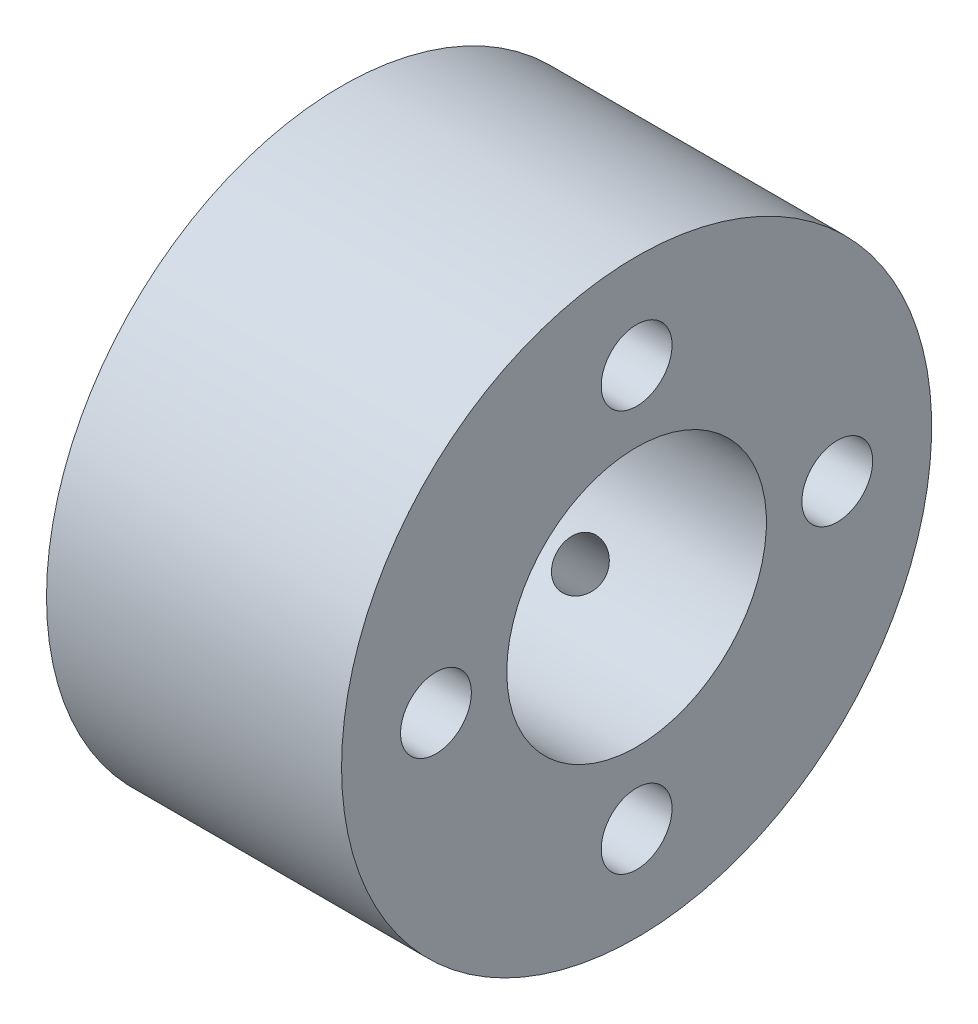
ISO-10303-21;
HEADER;
FILE_DESCRIPTION(('STEP AP214'),'2;1');
FILE_NAME('part.step','',(''),(''),'','','');
FILE_SCHEMA(('AUTOMOTIVE_DESIGN { 1 0 10303 214 1 1 1 1 }'));
ENDSEC;
DATA;
#1=APPLICATION_CONTEXT('core data for automotive mechanical design processes');
#2=APPLICATION_PROTOCOL_DEFINITION('international standard','automotive_design',2000,#1);
#3=PRODUCT_CONTEXT('',#1,'mechanical');
#4=PRODUCT('Part','Part','',(#3));
#5=PRODUCT_RELATED_PRODUCT_CATEGORY('part','',(#4));
#6=PRODUCT_DEFINITION_FORMATION('','',#4);
#7=PRODUCT_DEFINITION_CONTEXT('part definition',#1,'design');
#8=PRODUCT_DEFINITION('design','',#6,#7);
#9=PRODUCT_DEFINITION_SHAPE('','',#8);
#10=(LENGTH_UNIT() NAMED_UNIT(*) SI_UNIT(.MILLI.,.METRE.));
#11=(NAMED_UNIT(*) PLANE_ANGLE_UNIT() SI_UNIT($,.RADIAN.));
#12=(NAMED_UNIT(*) SI_UNIT($,.STERADIAN.) SOLID_ANGLE_UNIT());
#13=UNCERTAINTY_MEASURE_WITH_UNIT(LENGTH_MEASURE(1.E-05),#10,'distance_accuracy_value','');
#14=(GEOMETRIC_REPRESENTATION_CONTEXT(3) GLOBAL_UNCERTAINTY_ASSIGNED_CONTEXT((#13)) GLOBAL_UNIT_ASSIGNED_CONTEXT((#10,
#11,#12)) REPRESENTATION_CONTEXT('',''));
#15=CARTESIAN_POINT('',(0.,0.,0.));
#16=DIRECTION('',(0.,0.,1.));
#17=DIRECTION('',(1.,0.,0.));
#18=AXIS2_PLACEMENT_3D('',#15,#16,#17);
#19=CARTESIAN_POINT('',(-12.5,0.,-25.));
#20=DIRECTION('',(1.,0.,0.));
#21=DIRECTION('',(0.,0.,-1.));
#22=AXIS2_PLACEMENT_3D('',#19,#20,#21);
#23=PLANE('',#22);
#24=CARTESIAN_POINT('',(-12.5,1.78065548281E-13,17.));
#25=DIRECTION('',(1.,0.,0.));
#26=DIRECTION('',(0.,0.,-1.));
#27=AXIS2_PLACEMENT_3D('',#24,#25,#26);
#28=CIRCLE('',#27,3.);
#29=CARTESIAN_POINT('',(-12.5,1.78065548281E-13,14.));
#30=VERTEX_POINT('',#29);
#31=EDGE_CURVE('E69',#30,#30,#28,.T.);
#32=ORIENTED_EDGE('',*,*,#31,.T.);
#33=EDGE_LOOP('',(#32));
#34=FACE_BOUND('',#33,.T.);
#35=CARTESIAN_POINT('',(-12.5,-17.,0.));
#36=DIRECTION('',(1.,0.,0.));
#37=DIRECTION('',(0.,0.,-1.));
#38=AXIS2_PLACEMENT_3D('',#35,#36,#37);
#39=CIRCLE('',#38,3.);
#40=CARTESIAN_POINT('',(-12.5,-17.,-3.));
#41=VERTEX_POINT('',#40);
#42=EDGE_CURVE('E63',#41,#41,#39,.T.);
#43=ORIENTED_EDGE('',*,*,#42,.T.);
#44=EDGE_LOOP('',(#43));
#45=FACE_BOUND('',#44,.T.);
#46=CARTESIAN_POINT('',(-12.5,0.,-17.));
#47=DIRECTION('',(1.,0.,0.));
#48=DIRECTION('',(0.,0.,-1.));
#49=AXIS2_PLACEMENT_3D('',#46,#47,#48);
#50=CIRCLE('',#49,3.);
#51=CARTESIAN_POINT('',(-12.5,0.,-20.));
#52=VERTEX_POINT('',#51);
#53=EDGE_CURVE('E57',#52,#52,#50,.T.);
#54=ORIENTED_EDGE('',*,*,#53,.T.);
#55=EDGE_LOOP('',(#54));
#56=FACE_BOUND('',#55,.T.);
#57=CARTESIAN_POINT('',(-12.5,17.,0.));
#58=DIRECTION('',(1.,0.,0.));
#59=DIRECTION('',(0.,0.,-1.));
#60=AXIS2_PLACEMENT_3D('',#57,#58,#59);
#61=CIRCLE('',#60,3.);
#62=CARTESIAN_POINT('',(-12.5,17.,-3.));
#63=VERTEX_POINT('',#62);
#64=EDGE_CURVE('E51',#63,#63,#61,.T.);
#65=ORIENTED_EDGE('',*,*,#64,.T.);
#66=EDGE_LOOP('',(#65));
#67=FACE_BOUND('',#66,.T.);
#68=CARTESIAN_POINT('',(-12.5,0.,0.));
#69=DIRECTION('',(-1.,0.,0.));
#70=DIRECTION('',(0.,0.,1.));
#71=AXIS2_PLACEMENT_3D('',#68,#69,#70);
#72=CIRCLE('',#71,11.);
#73=CARTESIAN_POINT('',(-12.5,0.,11.));
#74=VERTEX_POINT('',#73);
#75=EDGE_CURVE('E10',#74,#74,#72,.T.);
#76=ORIENTED_EDGE('',*,*,#75,.F.);
#77=EDGE_LOOP('',(#76));
#78=FACE_BOUND('',#77,.T.);
#79=CARTESIAN_POINT('',(-12.5,0.,0.));
#80=DIRECTION('',(-1.,0.,0.));
#81=DIRECTION('',(0.,0.,1.));
#82=AXIS2_PLACEMENT_3D('',#79,#80,#81);
#83=CIRCLE('',#82,25.);
#84=CARTESIAN_POINT('',(-12.5,0.,25.));
#85=VERTEX_POINT('',#84);
#86=EDGE_CURVE('E46',#85,#85,#83,.T.);
#87=ORIENTED_EDGE('',*,*,#86,.T.);
#88=EDGE_LOOP('',(#87));
#89=FACE_BOUND('',#88,.T.);
#90=ADVANCED_FACE('F32',(#34,#45,#56,#67,#78,#89),#23,.F.);
#91=CARTESIAN_POINT('',(-25.731009954246,0.,0.));
#92=DIRECTION('',(-1.,0.,0.));
#93=DIRECTION('',(0.,0.,1.));
#94=AXIS2_PLACEMENT_3D('',#91,#92,#93);
#95=CYLINDRICAL_SURFACE('',#94,11.);
#96=CARTESIAN_POINT('',(0.,-6.23426021657251,-9.06278100541226));
#97=CARTESIAN_POINT('',(0.11134012257296,-6.23426477961424,-9.06277944137561));
#98=CARTESIAN_POINT('',(0.222737191288004,-6.24208562750692,-9.05741323905407));
#99=CARTESIAN_POINT('',(0.442394615872968,-6.27304058059289,-9.03600036843822));
#100=CARTESIAN_POINT('',(0.550652159669281,-6.29618799696593,-9.01994441599062));
#101=CARTESIAN_POINT('',(0.760820313018509,-6.35676231108609,-8.97735672941962));
#102=CARTESIAN_POINT('',(0.86273656530805,-6.39417629621741,-8.95083446755676));
#103=CARTESIAN_POINT('',(1.05752989162896,-6.48173149232353,-8.88763515920769));
#104=CARTESIAN_POINT('',(1.15040775801637,-6.53187158626262,-8.85095900395503));
#105=CARTESIAN_POINT('',(1.32558344744175,-6.64351822106949,-8.7674717908282));
#106=CARTESIAN_POINT('',(1.40776007423395,-6.70513847138314,-8.72055846017584));
#107=CARTESIAN_POINT('',(1.55814556283442,-6.83709248151678,-8.61749162693693));
#108=CARTESIAN_POINT('',(1.62635353364537,-6.90742679670856,-8.56133753533584));
#109=CARTESIAN_POINT('',(1.74732731845023,-7.05483669509965,-8.4402858707826));
#110=CARTESIAN_POINT('',(1.7999792699958,-7.13195687014483,-8.37532867005698));
#111=CARTESIAN_POINT('',(1.88761333302614,-7.28982236911334,-8.23828874395049));
#112=CARTESIAN_POINT('',(1.92259681050937,-7.37056741226238,-8.16620656993634));
#113=CARTESIAN_POINT('',(1.97352723325545,-7.53209778677381,-8.01744479612685));
#114=CARTESIAN_POINT('',(1.98967831432072,-7.61287300728532,-7.94082414054494));
#115=CARTESIAN_POINT('',(2.0031211674624,-7.77281962365421,-7.78432966687779));
#116=CARTESIAN_POINT('',(2.00041445357154,-7.85199114775545,-7.70445611046955));
#117=CARTESIAN_POINT('',(1.97637585792208,-8.00554269249041,-7.5447609862395));
#118=CARTESIAN_POINT('',(1.95526374648556,-8.07996816900079,-7.46494988896201));
#119=CARTESIAN_POINT('',(1.89536080253849,-8.22316515477451,-7.3069099746159));
#120=CARTESIAN_POINT('',(1.85656935461376,-8.29193646711916,-7.22868121272708));
#121=CARTESIAN_POINT('',(1.76219694022084,-8.42267707941132,-7.07592274519043));
#122=CARTESIAN_POINT('',(1.70652735596616,-8.4846080642971,-7.00141504205228));
#123=CARTESIAN_POINT('',(1.58004411007531,-8.60009939889827,-6.85906009060543));
#124=CARTESIAN_POINT('',(1.5092289970645,-8.65365894553856,-6.79121348152976));
#125=CARTESIAN_POINT('',(1.35325154542072,-8.75227487471011,-6.66365439383408));
#126=CARTESIAN_POINT('',(1.26789698208101,-8.79719745339056,-6.60407336861961));
#127=CARTESIAN_POINT('',(1.08590593607908,-8.87693798147825,-6.49649671967161));
#128=CARTESIAN_POINT('',(0.989269307234741,-8.91175579993738,-6.4485012460772));
#129=CARTESIAN_POINT('',(0.787217489513175,-8.97089048622427,-6.36598125808041));
#130=CARTESIAN_POINT('',(0.681789168360213,-8.99519129699531,-6.3314773498981));
#131=CARTESIAN_POINT('',(0.465282550111633,-9.03291206143895,-6.27754677266933));
#132=CARTESIAN_POINT('',(0.354204853488858,-9.04633316895866,-6.25811850478495));
#133=CARTESIAN_POINT('',(0.131240198794593,-9.06202045215445,-6.23538096899007));
#134=CARTESIAN_POINT('',(0.0193870673303661,-9.06444215137262,-6.23184697480502));
#135=CARTESIAN_POINT('',(-0.203424550561073,-9.05852539024086,-6.2404442149272));
#136=CARTESIAN_POINT('',(-0.31438307821396,-9.05018742860907,-6.25257472317333));
#137=CARTESIAN_POINT('',(-0.53138034405228,-9.02295894171529,-6.29180172386521));
#138=CARTESIAN_POINT('',(-0.637450384008025,-9.00415015930598,-6.31878226787442));
#139=CARTESIAN_POINT('',(-0.842659718828439,-8.956259449642,-6.38647989757827));
#140=CARTESIAN_POINT('',(-0.941798529085674,-8.92717680493338,-6.42719794259396));
#141=CARTESIAN_POINT('',(-1.13151919601524,-8.85871205584504,-6.52124434033618));
#142=CARTESIAN_POINT('',(-1.22199611808438,-8.81922124626785,-6.57470518205023));
#143=CARTESIAN_POINT('',(-1.39073369159775,-8.73060200666712,-6.69193357063052));
#144=CARTESIAN_POINT('',(-1.46899331199965,-8.68147276402579,-6.75570198645008));
#145=CARTESIAN_POINT('',(-1.61207284614978,-8.57361773576237,-6.89207631790516));
#146=CARTESIAN_POINT('',(-1.6767123553618,-8.51477957189947,-6.96478282320701));
#147=CARTESIAN_POINT('',(-1.78944630608299,-8.38898885712261,-7.11579290730796));
#148=CARTESIAN_POINT('',(-1.83754135727717,-8.32203660534642,-7.1940962797267));
#149=CARTESIAN_POINT('',(-1.91554803863643,-8.18177436519711,-7.3532135689415));
#150=CARTESIAN_POINT('',(-1.94554990487653,-8.10849804634402,-7.43401287835824));
#151=CARTESIAN_POINT('',(-1.98680734329715,-7.95709442263709,-7.59584868532176));
#152=CARTESIAN_POINT('',(-1.9980647651367,-7.87896759720945,-7.67688515867509));
#153=CARTESIAN_POINT('',(-2.00145252110551,-7.72117943420264,-7.83554260534047));
#154=CARTESIAN_POINT('',(-1.99385588848468,-7.64155638140332,-7.91319595453523));
#155=CARTESIAN_POINT('',(-1.96034705357606,-7.48206158678988,-8.0641686451913));
#156=CARTESIAN_POINT('',(-1.93443500480099,-7.40218984706575,-8.1374880229727));
#157=CARTESIAN_POINT('',(-1.86514309651073,-7.24483361499591,-8.27789207306368));
#158=CARTESIAN_POINT('',(-1.82179065462444,-7.16734558015666,-8.34498632894287));
#159=CARTESIAN_POINT('',(-1.71888059719124,-7.01715010930546,-8.47167451800135));
#160=CARTESIAN_POINT('',(-1.65932198372258,-6.94444296802736,-8.53126798897683));
#161=CARTESIAN_POINT('',(-1.52474236143811,-6.80533458442532,-8.64265465566911));
#162=CARTESIAN_POINT('',(-1.44952330461566,-6.7390318182601,-8.6943315779268));
#163=CARTESIAN_POINT('',(-1.28617048330646,-6.61625629247002,-8.78812475655437));
#164=CARTESIAN_POINT('',(-1.19803369143839,-6.55978584393895,-8.83023876585983));
#165=CARTESIAN_POINT('',(-1.01044032439888,-6.45842272053244,-8.90464906209268));
#166=CARTESIAN_POINT('',(-0.91089276068865,-6.41363399207022,-8.93685763299839));
#167=CARTESIAN_POINT('',(-0.703936723274016,-6.33817831539796,-8.99053154774776));
#168=CARTESIAN_POINT('',(-0.596535908392186,-6.30749781563868,-9.01200720273957));
#169=CARTESIAN_POINT('',(-0.407323315567745,-6.26790118942292,-9.03956918903648));
#170=CARTESIAN_POINT('',(-0.326630737391385,-6.25531515501099,-9.04826708713516));
#171=CARTESIAN_POINT('',(-0.163969047967817,-6.23849309020019,-9.05987350060511));
#172=CARTESIAN_POINT('',(-0.0819999679303418,-6.23425685597557,-9.06278215729671));
#173=CARTESIAN_POINT('',(0.,-6.23426021657251,-9.06278100541226));
#174=B_SPLINE_CURVE_WITH_KNOTS('',3,(#96,#97,#98,#99,#100,#101,#102,#103,#104,#105,#106,#107,
#108,#109,#110,#111,#112,#113,#114,#115,#116,#117,#118,#119,#120,#121,#122,#123,#124,#125,#126,
#127,#128,#129,#130,#131,#132,#133,#134,#135,#136,#137,#138,#139,#140,#141,#142,#143,#144,#145,
#146,#147,#148,#149,#150,#151,#152,#153,#154,#155,#156,#157,#158,#159,#160,#161,#162,#163,#164,
#165,#166,#167,#168,#169,#170,#171,#172,#173),.UNSPECIFIED.,.T.,.F.,(4,2,2,2,2,2,2,2,2,2,2,2,2,
2,2,2,2,2,2,2,2,2,2,2,2,2,2,2,2,2,2,2,2,2,2,2,2,2,4),(0.,0.33372035262877,0.667730923425359,
1.00143989738151,1.33511959011685,1.67229935115259,2.00950061266477,2.34911212511977,
2.68869737725139,3.02456639415963,3.36040844551729,3.69229445292966,4.02419201411037,
4.35786328487979,4.6915665452344,5.03008350848144,5.36860485839154,5.70764124486731,
6.04664167012787,6.38083364646978,6.71501013332592,7.04661365662175,7.37824034134337,
7.71347820234124,8.04874433945131,8.38820522569593,8.72765360102075,9.06539473675366,
9.40310254298624,9.7359484788693,10.0687916249998,10.4011135484041,10.7334559397116,
11.0702887970716,11.4072007206838,11.7470154829573,12.0865031534681,12.3322881015162,
12.5780670496696),.UNSPECIFIED.);
#175=CARTESIAN_POINT('',(0.,-6.23426021657251,-9.06278100541226));
#176=VERTEX_POINT('',#175);
#177=EDGE_CURVE('E83',#176,#176,#174,.T.);
#178=ORIENTED_EDGE('',*,*,#177,.T.);
#179=EDGE_LOOP('',(#178));
#180=FACE_BOUND('',#179,.T.);
#181=CARTESIAN_POINT('',(12.5,0.,0.));
#182=DIRECTION('',(-1.,0.,0.));
#183=DIRECTION('',(0.,0.,1.));
#184=AXIS2_PLACEMENT_3D('',#181,#182,#183);
#185=CIRCLE('',#184,11.);
#186=CARTESIAN_POINT('',(12.5,0.,11.));
#187=VERTEX_POINT('',#186);
#188=EDGE_CURVE('E38',#187,#187,#185,.T.);
#189=ORIENTED_EDGE('',*,*,#188,.F.);
#190=EDGE_LOOP('',(#189));
#191=FACE_BOUND('',#190,.T.);
#192=ORIENTED_EDGE('',*,*,#75,.T.);
#193=EDGE_LOOP('',(#192));
#194=FACE_BOUND('',#193,.T.);
#195=ADVANCED_FACE('F121',(#180,#191,#194),#95,.F.);
#196=CARTESIAN_POINT('',(12.5,0.,-11.));
#197=DIRECTION('',(-1.,0.,0.));
#198=DIRECTION('',(0.,0.,1.));
#199=AXIS2_PLACEMENT_3D('',#196,#197,#198);
#200=PLANE('',#199);
#201=CARTESIAN_POINT('',(12.5,1.78065548281E-13,17.));
#202=DIRECTION('',(1.,0.,0.));
#203=DIRECTION('',(0.,0.,-1.));
#204=AXIS2_PLACEMENT_3D('',#201,#202,#203);
#205=CIRCLE('',#204,2.99999999999999);
#206=CARTESIAN_POINT('',(12.5,1.78065548281E-13,14.));
#207=VERTEX_POINT('',#206);
#208=EDGE_CURVE('E72',#207,#207,#205,.T.);
#209=ORIENTED_EDGE('',*,*,#208,.F.);
#210=EDGE_LOOP('',(#209));
#211=FACE_BOUND('',#210,.T.);
#212=CARTESIAN_POINT('',(12.5,-17.,0.));
#213=DIRECTION('',(1.,0.,0.));
#214=DIRECTION('',(0.,0.,-1.));
#215=AXIS2_PLACEMENT_3D('',#212,#213,#214);
#216=CIRCLE('',#215,2.99999999999999);
#217=CARTESIAN_POINT('',(12.5,-17.,-2.99999999999999));
#218=VERTEX_POINT('',#217);
#219=EDGE_CURVE('E66',#218,#218,#216,.T.);
#220=ORIENTED_EDGE('',*,*,#219,.F.);
#221=EDGE_LOOP('',(#220));
#222=FACE_BOUND('',#221,.T.);
#223=CARTESIAN_POINT('',(12.5,0.,-17.));
#224=DIRECTION('',(1.,0.,0.));
#225=DIRECTION('',(0.,0.,-1.));
#226=AXIS2_PLACEMENT_3D('',#223,#224,#225);
#227=CIRCLE('',#226,2.99999999999999);
#228=CARTESIAN_POINT('',(12.5,0.,-20.));
#229=VERTEX_POINT('',#228);
#230=EDGE_CURVE('E60',#229,#229,#227,.T.);
#231=ORIENTED_EDGE('',*,*,#230,.F.);
#232=EDGE_LOOP('',(#231));
#233=FACE_BOUND('',#232,.T.);
#234=CARTESIAN_POINT('',(12.5,17.,0.));
#235=DIRECTION('',(1.,0.,0.));
#236=DIRECTION('',(0.,0.,-1.));
#237=AXIS2_PLACEMENT_3D('',#234,#235,#236);
#238=CIRCLE('',#237,2.99999999999999);
#239=CARTESIAN_POINT('',(12.5,17.,-2.99999999999999));
#240=VERTEX_POINT('',#239);
#241=EDGE_CURVE('E54',#240,#240,#238,.T.);
#242=ORIENTED_EDGE('',*,*,#241,.F.);
#243=EDGE_LOOP('',(#242));
#244=FACE_BOUND('',#243,.T.);
#245=CARTESIAN_POINT('',(12.5,0.,0.));
#246=DIRECTION('',(-1.,0.,0.));
#247=DIRECTION('',(0.,0.,1.));
#248=AXIS2_PLACEMENT_3D('',#245,#246,#247);
#249=CIRCLE('',#248,25.);
#250=CARTESIAN_POINT('',(12.5,0.,25.));
#251=VERTEX_POINT('',#250);
#252=EDGE_CURVE('E42',#251,#251,#249,.T.);
#253=ORIENTED_EDGE('',*,*,#252,.F.);
#254=EDGE_LOOP('',(#253));
#255=FACE_BOUND('',#254,.T.);
#256=ORIENTED_EDGE('',*,*,#188,.T.);
#257=EDGE_LOOP('',(#256));
#258=FACE_BOUND('',#257,.T.);
#259=ADVANCED_FACE('F116',(#211,#222,#233,#244,#255,#258),#200,.F.);
#260=CARTESIAN_POINT('',(-25.731009954246,0.,0.));
#261=DIRECTION('',(-1.,0.,0.));
#262=DIRECTION('',(0.,0.,1.));
#263=AXIS2_PLACEMENT_3D('',#260,#261,#262);
#264=CYLINDRICAL_SURFACE('',#263,25.);
#265=CARTESIAN_POINT('',(0.,-16.2066800710342,-19.0353229832105));
#266=CARTESIAN_POINT('',(-0.112147853674172,-16.2066842920145,-19.0353202663091));
#267=CARTESIAN_POINT('',(-0.224372446391737,-16.2139136606911,-19.029171636725));
#268=CARTESIAN_POINT('',(-0.445717656415227,-16.2426024534647,-19.0046890905531));
#269=CARTESIAN_POINT('',(-0.554834591780895,-16.2640780801123,-18.9863412995638));
#270=CARTESIAN_POINT('',(-0.766726558177983,-16.3205022919411,-18.9378610254156));
#271=CARTESIAN_POINT('',(-0.869505102905768,-16.3554433332364,-18.9077351406984));
#272=CARTESIAN_POINT('',(-1.06585570765538,-16.4375906370784,-18.8363627161796));
#273=CARTESIAN_POINT('',(-1.15942975490134,-16.4847942441248,-18.7951185839994));
#274=CARTESIAN_POINT('',(-1.33496241108218,-16.5899973249682,-18.7023234970488));
#275=CARTESIAN_POINT('',(-1.41689614416688,-16.6480193243669,-18.6507510201225));
#276=CARTESIAN_POINT('',(-1.56660878053209,-16.7728893135657,-18.5385332674918));
#277=CARTESIAN_POINT('',(-1.63438707048603,-16.83973768559,-18.4778875988598));
#278=CARTESIAN_POINT('',(-1.7539467670301,-16.9802103356512,-18.3488841279644));
#279=CARTESIAN_POINT('',(-1.8057067746231,-17.0538435087203,-18.2805161743228));
#280=CARTESIAN_POINT('',(-1.89162374066323,-17.2055018520611,-18.1378480867695));
#281=CARTESIAN_POINT('',(-1.9257809857297,-17.2835269507977,-18.0635480494704));
#282=CARTESIAN_POINT('',(-1.97545156319552,-17.4414194851821,-17.9111388164605));
#283=CARTESIAN_POINT('',(-1.9910049790527,-17.5212825806507,-17.8330381889274));
#284=CARTESIAN_POINT('',(-2.00315028336409,-17.680662772216,-17.6750319272296));
#285=CARTESIAN_POINT('',(-1.99974249958767,-17.7601798742698,-17.5951263242901));
#286=CARTESIAN_POINT('',(-1.97409496778474,-17.9164368947213,-17.4359886446119));
#287=CARTESIAN_POINT('',(-1.95189832511151,-17.9931827510449,-17.356755445147));
#288=CARTESIAN_POINT('',(-1.88937015827981,-18.1420203874768,-17.2011249027477));
#289=CARTESIAN_POINT('',(-1.84903847308588,-18.2141121262511,-17.1247275850019));
#290=CARTESIAN_POINT('',(-1.75133690957108,-18.3518692649908,-16.9770173107581));
#291=CARTESIAN_POINT('',(-1.69394768512745,-18.4175272549633,-16.9057102419597));
#292=CARTESIAN_POINT('',(-1.56377416249065,-18.5407178885211,-16.7705145452757));
#293=CARTESIAN_POINT('',(-1.49098957689705,-18.5982503803862,-16.7066260559145));
#294=CARTESIAN_POINT('',(-1.3318483837377,-18.7039915945337,-16.5881594784182));
#295=CARTESIAN_POINT('',(-1.24545432793222,-18.7521737465965,-16.5336079729312));
#296=CARTESIAN_POINT('',(-1.06167723346417,-18.8379188467443,-16.4358466606552));
#297=CARTESIAN_POINT('',(-0.964294186739575,-18.8754817870385,-16.392636862187));
#298=CARTESIAN_POINT('',(-0.761277514275493,-18.9391600005354,-16.3190256831525));
#299=CARTESIAN_POINT('',(-0.655642983456836,-18.9652740158586,-16.2886257100004));
#300=CARTESIAN_POINT('',(-0.439134214491431,-19.0054768776147,-16.2416997818416));
#301=CARTESIAN_POINT('',(-0.328260077801608,-19.0195659567915,-16.225173558307));
#302=CARTESIAN_POINT('',(-0.104748103504659,-19.0353916981177,-16.206604035086));
#303=CARTESIAN_POINT('',(0.00788399962282174,-19.0371624595931,-16.2045207547815));
#304=CARTESIAN_POINT('',(0.232003494728472,-19.0284037746927,-16.214804766967));
#305=CARTESIAN_POINT('',(0.343490896526371,-19.0178744339215,-16.2271719353903));
#306=CARTESIAN_POINT('',(0.562006294685619,-18.9847651491494,-16.2658947825953));
#307=CARTESIAN_POINT('',(0.669039995735834,-18.9622011666282,-16.292231932813));
#308=CARTESIAN_POINT('',(0.875786298847528,-18.9055205242488,-16.3579695054338));
#309=CARTESIAN_POINT('',(0.975498792480315,-18.8714036933324,-16.397370121262));
#310=CARTESIAN_POINT('',(1.165012079284,-18.7922763386085,-16.4879945020617));
#311=CARTESIAN_POINT('',(1.25479067981361,-18.7472421131574,-16.5392439795264));
#312=CARTESIAN_POINT('',(1.4216635305496,-18.6473286700087,-16.6518101759497));
#313=CARTESIAN_POINT('',(1.49875757939722,-18.5924492960549,-16.7131270546905));
#314=CARTESIAN_POINT('',(1.63825137667552,-18.4739808260198,-16.843984829048));
#315=CARTESIAN_POINT('',(1.7006171153653,-18.4103720974806,-16.9135442126221));
#316=CARTESIAN_POINT('',(1.80865071989544,-18.2760866059715,-17.0585582805179));
#317=CARTESIAN_POINT('',(1.85431874131599,-18.205409908865,-17.1340129099029));
#318=CARTESIAN_POINT('',(1.9276020206529,-18.0588772624449,-17.2883849727906));
#319=CARTESIAN_POINT('',(1.95523839765751,-17.983027487437,-17.3672982393802));
#320=CARTESIAN_POINT('',(1.99174293337582,-17.8281056115804,-17.5262935242263));
#321=CARTESIAN_POINT('',(2.00061141672434,-17.7490335664925,-17.6063755222427));
#322=CARTESIAN_POINT('',(1.99932476322647,-17.5901063611614,-17.765155251348));
#323=CARTESIAN_POINT('',(1.98922266744311,-17.5102540035211,-17.8438562228644));
#324=CARTESIAN_POINT('',(1.95039211378511,-17.351865584035,-17.9979157459361));
#325=CARTESIAN_POINT('',(1.92166362904064,-17.2733295240882,-18.0732742926695));
#326=CARTESIAN_POINT('',(1.84640903482433,-17.1199332651783,-18.2186459473447));
#327=CARTESIAN_POINT('',(1.7998837616724,-17.0450728936709,-18.2886593062861));
#328=CARTESIAN_POINT('',(1.69036249537071,-16.9013340320963,-18.4215770976925));
#329=CARTESIAN_POINT('',(1.62736679231072,-16.832455436702,-18.4844816553353));
#330=CARTESIAN_POINT('',(1.48649399715609,-16.7026841819986,-18.6018286341023));
#331=CARTESIAN_POINT('',(1.40857774622937,-16.641813264161,-18.6562480887186));
#332=CARTESIAN_POINT('',(1.24014438954589,-16.5302452987547,-18.7551743743141));
#333=CARTESIAN_POINT('',(1.14962423122777,-16.4795507230955,-18.7996787971457));
#334=CARTESIAN_POINT('',(0.958390065510965,-16.3899720190744,-18.877827420149));
#335=CARTESIAN_POINT('',(0.857658417506951,-16.3511088096402,-18.9114523909774));
#336=CARTESIAN_POINT('',(0.64905850357319,-16.2866844662139,-18.9669642885412));
#337=CARTESIAN_POINT('',(0.541198632799405,-16.2611079879278,-18.9888647563152));
#338=CARTESIAN_POINT('',(0.360581735917688,-16.2306815747535,-19.0148680068436));
#339=CARTESIAN_POINT('',(0.288987464721673,-16.2216950782101,-19.0225306382345));
#340=CARTESIAN_POINT('',(0.144939480371989,-16.2096929695399,-19.0327589982209));
#341=CARTESIAN_POINT('',(0.0724857693162467,-16.2066773428411,-19.0353247392556));
#342=CARTESIAN_POINT('',(0.,-16.2066800710342,-19.0353229832105));
#343=B_SPLINE_CURVE_WITH_KNOTS('',3,(#265,#266,#267,#268,#269,#270,#271,#272,#273,#274,#275,
#276,#277,#278,#279,#280,#281,#282,#283,#284,#285,#286,#287,#288,#289,#290,#291,#292,#293,#294,
#295,#296,#297,#298,#299,#300,#301,#302,#303,#304,#305,#306,#307,#308,#309,#310,#311,#312,#313,
#314,#315,#316,#317,#318,#319,#320,#321,#322,#323,#324,#325,#326,#327,#328,#329,#330,#331,#332,
#333,#334,#335,#336,#337,#338,#339,#340,#341,#342),.UNSPECIFIED.,.T.,.F.,(4,2,2,2,2,2,2,2,2,2,2,
2,2,2,2,2,2,2,2,2,2,2,2,2,2,2,2,2,2,2,2,2,2,2,2,2,2,2,4),(0.,0.33617890938388,0.672740818698466,
1.0091144454943,1.34541529007444,1.68242434822536,2.01944800526569,2.356919971462,
2.69438644255222,3.03112449746248,3.36785673142907,3.70381852241058,4.03978329672297,
4.37613057520015,4.71248413315913,5.04977992078598,5.38707595586999,5.72440903998025,
6.06173559482742,6.39812799600615,6.73451750905465,7.07046197594157,7.40641141723672,
7.74309684057557,8.07978760805432,8.41724840176259,8.75470605111589,9.09176774920679,
9.42882361697635,9.76493849142069,10.1010538507349,10.4371534170066,10.7732470640349,
11.1102351838792,11.4473050618614,11.7849674942507,12.122239102542,12.3395258855511,
12.5568121382634),.UNSPECIFIED.);
#344=CARTESIAN_POINT('',(0.,-16.2066800710342,-19.0353229832105));
#345=VERTEX_POINT('',#344);
#346=EDGE_CURVE('E75',#345,#345,#343,.T.);
#347=ORIENTED_EDGE('',*,*,#346,.T.);
#348=EDGE_LOOP('',(#347));
#349=FACE_BOUND('',#348,.T.);
#350=ORIENTED_EDGE('',*,*,#86,.F.);
#351=EDGE_LOOP('',(#350));
#352=FACE_BOUND('',#351,.T.);
#353=ORIENTED_EDGE('',*,*,#252,.T.);
#354=EDGE_LOOP('',(#353));
#355=FACE_BOUND('',#354,.T.);
#356=ADVANCED_FACE('F88',(#349,#352,#355),#264,.T.);
#357=CARTESIAN_POINT('',(12.5,17.,0.));
#358=DIRECTION('',(1.,0.,0.));
#359=DIRECTION('',(0.,0.,-1.));
#360=AXIS2_PLACEMENT_3D('',#357,#358,#359);
#361=CYLINDRICAL_SURFACE('',#360,2.99999999999999);
#362=ORIENTED_EDGE('',*,*,#64,.F.);
#363=EDGE_LOOP('',(#362));
#364=FACE_BOUND('',#363,.T.);
#365=ORIENTED_EDGE('',*,*,#241,.T.);
#366=EDGE_LOOP('',(#365));
#367=FACE_BOUND('',#366,.T.);
#368=ADVANCED_FACE('F109',(#364,#367),#361,.F.);
#369=CARTESIAN_POINT('',(12.5,0.,-17.));
#370=DIRECTION('',(1.,0.,0.));
#371=DIRECTION('',(0.,0.,-1.));
#372=AXIS2_PLACEMENT_3D('',#369,#370,#371);
#373=CYLINDRICAL_SURFACE('',#372,2.99999999999999);
#374=ORIENTED_EDGE('',*,*,#53,.F.);
#375=EDGE_LOOP('',(#374));
#376=FACE_BOUND('',#375,.T.);
#377=ORIENTED_EDGE('',*,*,#230,.T.);
#378=EDGE_LOOP('',(#377));
#379=FACE_BOUND('',#378,.T.);
#380=ADVANCED_FACE('F106',(#376,#379),#373,.F.);
#381=CARTESIAN_POINT('',(12.5,-17.,0.));
#382=DIRECTION('',(1.,0.,0.));
#383=DIRECTION('',(0.,0.,-1.));
#384=AXIS2_PLACEMENT_3D('',#381,#382,#383);
#385=CYLINDRICAL_SURFACE('',#384,2.99999999999999);
#386=ORIENTED_EDGE('',*,*,#42,.F.);
#387=EDGE_LOOP('',(#386));
#388=FACE_BOUND('',#387,.T.);
#389=ORIENTED_EDGE('',*,*,#219,.T.);
#390=EDGE_LOOP('',(#389));
#391=FACE_BOUND('',#390,.T.);
#392=ADVANCED_FACE('F102',(#388,#391),#385,.F.);
#393=CARTESIAN_POINT('',(12.5,1.78065548281E-13,17.));
#394=DIRECTION('',(1.,0.,0.));
#395=DIRECTION('',(0.,0.,-1.));
#396=AXIS2_PLACEMENT_3D('',#393,#394,#395);
#397=CYLINDRICAL_SURFACE('',#396,2.99999999999999);
#398=ORIENTED_EDGE('',*,*,#31,.F.);
#399=EDGE_LOOP('',(#398));
#400=FACE_BOUND('',#399,.T.);
#401=ORIENTED_EDGE('',*,*,#208,.T.);
#402=EDGE_LOOP('',(#401));
#403=FACE_BOUND('',#402,.T.);
#404=ADVANCED_FACE('F95',(#400,#403),#397,.F.);
#405=CARTESIAN_POINT('',(0.,-17.6775612886646,-17.67777777));
#406=DIRECTION('',(0.,-0.707102451546584,-0.7071111108));
#407=DIRECTION('',(0.,0.7071111108,-0.707102451546584));
#408=AXIS2_PLACEMENT_3D('',#405,#406,#407);
#409=CYLINDRICAL_SURFACE('',#408,2.);
#410=ORIENTED_EDGE('',*,*,#177,.F.);
#411=EDGE_LOOP('',(#410));
#412=FACE_BOUND('',#411,.T.);
#413=ORIENTED_EDGE('',*,*,#346,.F.);
#414=EDGE_LOOP('',(#413));
#415=FACE_BOUND('',#414,.T.);
#416=ADVANCED_FACE('F92',(#412,#415),#409,.F.);
#417=CLOSED_SHELL('',(#90,#195,#259,#356,#368,#380,#392,#404,#416));
#418=MANIFOLD_SOLID_BREP('B2',#417);
#419=ADVANCED_BREP_SHAPE_REPRESENTATION('',(#18,#418),#14);
#420=SHAPE_DEFINITION_REPRESENTATION(#9,#419);
ENDSEC;
END-ISO-10303-21;
